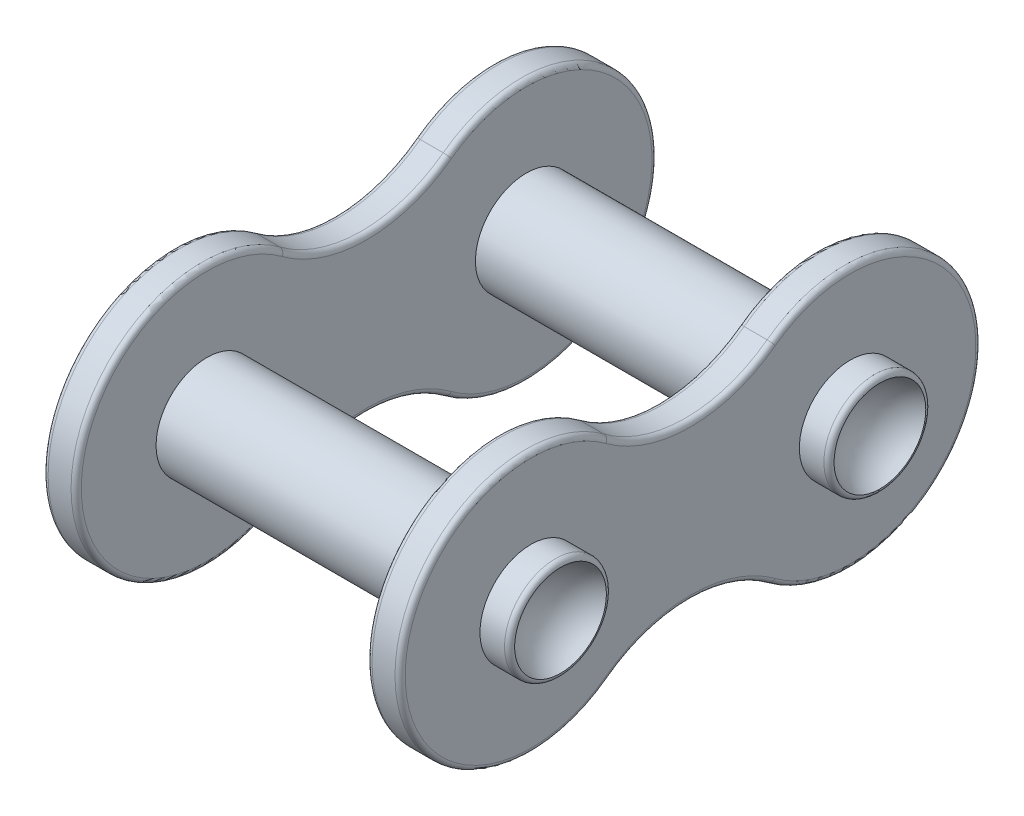
ISO-10303-21;
HEADER;
FILE_DESCRIPTION(('STEP AP214'),'2;1');
FILE_NAME('part.step','',(''),(''),'','','');
FILE_SCHEMA(('AUTOMOTIVE_DESIGN { 1 0 10303 214 1 1 1 1 }'));
ENDSEC;
DATA;
#1=APPLICATION_CONTEXT('core data for automotive mechanical design processes');
#2=APPLICATION_PROTOCOL_DEFINITION('international standard','automotive_design',2000,#1);
#3=PRODUCT_CONTEXT('',#1,'mechanical');
#4=PRODUCT('Part','Part','',(#3));
#5=PRODUCT_RELATED_PRODUCT_CATEGORY('part','',(#4));
#6=PRODUCT_DEFINITION_FORMATION('','',#4);
#7=PRODUCT_DEFINITION_CONTEXT('part definition',#1,'design');
#8=PRODUCT_DEFINITION('design','',#6,#7);
#9=PRODUCT_DEFINITION_SHAPE('','',#8);
#10=(LENGTH_UNIT() NAMED_UNIT(*) SI_UNIT(.MILLI.,.METRE.));
#11=(NAMED_UNIT(*) PLANE_ANGLE_UNIT() SI_UNIT($,.RADIAN.));
#12=(NAMED_UNIT(*) SI_UNIT($,.STERADIAN.) SOLID_ANGLE_UNIT());
#13=UNCERTAINTY_MEASURE_WITH_UNIT(LENGTH_MEASURE(1.E-05),#10,'distance_accuracy_value','');
#14=(GEOMETRIC_REPRESENTATION_CONTEXT(3) GLOBAL_UNCERTAINTY_ASSIGNED_CONTEXT((#13)) GLOBAL_UNIT_ASSIGNED_CONTEXT((#10,
#11,#12)) REPRESENTATION_CONTEXT('',''));
#15=CARTESIAN_POINT('',(0.,0.,0.));
#16=DIRECTION('',(0.,0.,1.));
#17=DIRECTION('',(1.,0.,0.));
#18=AXIS2_PLACEMENT_3D('',#15,#16,#17);
#19=CARTESIAN_POINT('',(-17.575,0.,-7.9375));
#20=DIRECTION('',(1.,0.,0.));
#21=DIRECTION('',(0.,0.,-1.));
#22=AXIS2_PLACEMENT_3D('',#19,#20,#21);
#23=CYLINDRICAL_SURFACE('',#22,2.53);
#24=CARTESIAN_POINT('',(0.,0.,-7.9375));
#25=DIRECTION('',(1.,0.,0.));
#26=DIRECTION('',(0.,0.,-1.));
#27=AXIS2_PLACEMENT_3D('',#24,#25,#26);
#28=CIRCLE('',#27,2.53);
#29=CARTESIAN_POINT('',(0.,0.,-10.4675));
#30=VERTEX_POINT('',#29);
#31=EDGE_CURVE('E303',#30,#30,#28,.T.);
#32=ORIENTED_EDGE('',*,*,#31,.F.);
#33=EDGE_LOOP('',(#32));
#34=FACE_BOUND('',#33,.T.);
#35=CARTESIAN_POINT('',(-14.45,0.,-7.9375));
#36=DIRECTION('',(1.,0.,0.));
#37=DIRECTION('',(0.,0.,-1.));
#38=AXIS2_PLACEMENT_3D('',#35,#36,#37);
#39=CIRCLE('',#38,2.53);
#40=CARTESIAN_POINT('',(-14.45,0.,-10.4675));
#41=VERTEX_POINT('',#40);
#42=EDGE_CURVE('E297',#41,#41,#39,.T.);
#43=ORIENTED_EDGE('',*,*,#42,.T.);
#44=EDGE_LOOP('',(#43));
#45=FACE_BOUND('',#44,.T.);
#46=ADVANCED_FACE('F38',(#34,#45),#23,.T.);
#47=CARTESIAN_POINT('',(1.65,5.33631865351914,-3.96875));
#48=DIRECTION('',(1.,0.,0.));
#49=DIRECTION('',(0.,0.,-1.));
#50=AXIS2_PLACEMENT_3D('',#47,#48,#49);
#51=PLANE('',#50);
#52=CARTESIAN_POINT('',(1.65,0.,-7.9375));
#53=DIRECTION('',(1.,0.,0.));
#54=DIRECTION('',(0.,0.,-1.));
#55=AXIS2_PLACEMENT_3D('',#52,#53,#54);
#56=CIRCLE('',#55,6.246);
#57=CARTESIAN_POINT('',(1.65,-5.01185678442604,-4.21006018527427));
#58=VERTEX_POINT('',#57);
#59=CARTESIAN_POINT('',(1.65,5.01185678442604,-4.21006018527427));
#60=VERTEX_POINT('',#59);
#61=EDGE_CURVE('E178',#58,#60,#56,.T.);
#62=ORIENTED_EDGE('',*,*,#61,.T.);
#63=CARTESIAN_POINT('',(1.65,10.6726373070383,0.));
#64=DIRECTION('',(1.,0.,0.));
#65=DIRECTION('',(0.,0.,-1.));
#66=AXIS2_PLACEMENT_3D('',#63,#64,#65);
#67=CIRCLE('',#66,7.0547177752776);
#68=CARTESIAN_POINT('',(1.65,5.01185678442604,4.21006018527427));
#69=VERTEX_POINT('',#68);
#70=EDGE_CURVE('E157',#60,#69,#67,.F.);
#71=ORIENTED_EDGE('',*,*,#70,.T.);
#72=CARTESIAN_POINT('',(1.65,0.,7.9375));
#73=DIRECTION('',(1.,0.,0.));
#74=DIRECTION('',(0.,0.,-1.));
#75=AXIS2_PLACEMENT_3D('',#72,#73,#74);
#76=CIRCLE('',#75,6.246);
#77=CARTESIAN_POINT('',(1.65,-5.01185678442604,4.21006018527427));
#78=VERTEX_POINT('',#77);
#79=EDGE_CURVE('E166',#69,#78,#76,.T.);
#80=ORIENTED_EDGE('',*,*,#79,.T.);
#81=CARTESIAN_POINT('',(1.65,-10.6726373070383,0.));
#82=DIRECTION('',(1.,0.,0.));
#83=DIRECTION('',(0.,0.,-1.));
#84=AXIS2_PLACEMENT_3D('',#81,#82,#83);
#85=CIRCLE('',#84,7.0547177752776);
#86=EDGE_CURVE('E172',#78,#58,#85,.F.);
#87=ORIENTED_EDGE('',*,*,#86,.T.);
#88=EDGE_LOOP('',(#62,#71,#80,#87));
#89=FACE_BOUND('',#88,.T.);
#90=CARTESIAN_POINT('',(1.65,0.,-7.9375));
#91=DIRECTION('',(1.,0.,0.));
#92=DIRECTION('',(0.,0.,-1.));
#93=AXIS2_PLACEMENT_3D('',#90,#91,#92);
#94=CIRCLE('',#93,2.53);
#95=CARTESIAN_POINT('',(1.65,0.,-10.4675));
#96=VERTEX_POINT('',#95);
#97=EDGE_CURVE('E309',#96,#96,#94,.T.);
#98=ORIENTED_EDGE('',*,*,#97,.F.);
#99=EDGE_LOOP('',(#98));
#100=FACE_BOUND('',#99,.T.);
#101=CARTESIAN_POINT('',(1.65,0.,7.9375));
#102=DIRECTION('',(1.,0.,0.));
#103=DIRECTION('',(0.,0.,1.));
#104=AXIS2_PLACEMENT_3D('',#101,#102,#103);
#105=CIRCLE('',#104,2.53);
#106=CARTESIAN_POINT('',(1.65,0.,10.4675));
#107=VERTEX_POINT('',#106);
#108=EDGE_CURVE('E306',#107,#107,#105,.T.);
#109=ORIENTED_EDGE('',*,*,#108,.F.);
#110=EDGE_LOOP('',(#109));
#111=FACE_BOUND('',#110,.T.);
#112=ADVANCED_FACE('F175',(#89,#100,#111),#51,.T.);
#113=CARTESIAN_POINT('',(0.,5.33631865351914,-3.96875));
#114=DIRECTION('',(1.,0.,0.));
#115=DIRECTION('',(0.,0.,-1.));
#116=AXIS2_PLACEMENT_3D('',#113,#114,#115);
#117=PLANE('',#116);
#118=CARTESIAN_POINT('',(0.,0.,7.9375));
#119=DIRECTION('',(1.,0.,0.));
#120=DIRECTION('',(0.,0.,-1.));
#121=AXIS2_PLACEMENT_3D('',#118,#119,#120);
#122=CIRCLE('',#121,6.246);
#123=CARTESIAN_POINT('',(0.,-5.01185678442604,4.21006018527427));
#124=VERTEX_POINT('',#123);
#125=CARTESIAN_POINT('',(0.,5.01185678442604,4.21006018527427));
#126=VERTEX_POINT('',#125);
#127=EDGE_CURVE('E196',#124,#126,#122,.F.);
#128=ORIENTED_EDGE('',*,*,#127,.T.);
#129=CARTESIAN_POINT('',(0.,10.6726373070383,0.));
#130=DIRECTION('',(1.,0.,0.));
#131=DIRECTION('',(0.,0.,-1.));
#132=AXIS2_PLACEMENT_3D('',#129,#130,#131);
#133=CIRCLE('',#132,7.0547177752776);
#134=CARTESIAN_POINT('',(0.,5.01185678442604,-4.21006018527427));
#135=VERTEX_POINT('',#134);
#136=EDGE_CURVE('E202',#126,#135,#133,.T.);
#137=ORIENTED_EDGE('',*,*,#136,.T.);
#138=CARTESIAN_POINT('',(0.,0.,-7.9375));
#139=DIRECTION('',(1.,0.,0.));
#140=DIRECTION('',(0.,0.,-1.));
#141=AXIS2_PLACEMENT_3D('',#138,#139,#140);
#142=CIRCLE('',#141,6.246);
#143=CARTESIAN_POINT('',(0.,-5.01185678442604,-4.21006018527427));
#144=VERTEX_POINT('',#143);
#145=EDGE_CURVE('E200',#135,#144,#142,.F.);
#146=ORIENTED_EDGE('',*,*,#145,.T.);
#147=CARTESIAN_POINT('',(0.,-10.6726373070383,0.));
#148=DIRECTION('',(1.,0.,0.));
#149=DIRECTION('',(0.,0.,-1.));
#150=AXIS2_PLACEMENT_3D('',#147,#148,#149);
#151=CIRCLE('',#150,7.0547177752776);
#152=EDGE_CURVE('E198',#144,#124,#151,.T.);
#153=ORIENTED_EDGE('',*,*,#152,.T.);
#154=EDGE_LOOP('',(#128,#137,#146,#153));
#155=FACE_BOUND('',#154,.T.);
#156=ORIENTED_EDGE('',*,*,#31,.T.);
#157=EDGE_LOOP('',(#156));
#158=FACE_BOUND('',#157,.T.);
#159=CARTESIAN_POINT('',(0.,0.,7.9375));
#160=DIRECTION('',(1.,0.,0.));
#161=DIRECTION('',(0.,0.,-1.));
#162=AXIS2_PLACEMENT_3D('',#159,#160,#161);
#163=CIRCLE('',#162,2.53);
#164=CARTESIAN_POINT('',(0.,0.,5.4075));
#165=VERTEX_POINT('',#164);
#166=EDGE_CURVE('E332',#165,#165,#163,.F.);
#167=ORIENTED_EDGE('',*,*,#166,.F.);
#168=EDGE_LOOP('',(#167));
#169=FACE_BOUND('',#168,.T.);
#170=ADVANCED_FACE('F391',(#155,#158,#169),#117,.F.);
#171=CARTESIAN_POINT('',(1.65,10.6726373070383,0.));
#172=DIRECTION('',(-1.,0.,0.));
#173=DIRECTION('',(0.,0.,1.));
#174=AXIS2_PLACEMENT_3D('',#171,#172,#173);
#175=CYLINDRICAL_SURFACE('',#174,6.8007177752776);
#176=DIRECTION('',(-1.,0.,0.));
#177=VECTOR('',#176,1.);
#178=CARTESIAN_POINT('',(1.65,5.21566908401686,4.05848001989797));
#179=LINE('',#178,#177);
#180=CARTESIAN_POINT('',(1.396,5.21566908401686,4.05848001989797));
#181=VERTEX_POINT('',#180);
#182=CARTESIAN_POINT('',(0.254000000000001,5.21566908401686,4.05848001989797));
#183=VERTEX_POINT('',#182);
#184=EDGE_CURVE('E321',#181,#183,#179,.T.);
#185=ORIENTED_EDGE('',*,*,#184,.F.);
#186=CARTESIAN_POINT('',(1.396,10.6726373070383,0.));
#187=DIRECTION('',(1.,0.,0.));
#188=DIRECTION('',(0.,0.,-1.));
#189=AXIS2_PLACEMENT_3D('',#186,#187,#188);
#190=CIRCLE('',#189,6.8007177752776);
#191=CARTESIAN_POINT('',(1.396,5.21566908401686,-4.05848001989797));
#192=VERTEX_POINT('',#191);
#193=EDGE_CURVE('E159',#181,#192,#190,.T.);
#194=ORIENTED_EDGE('',*,*,#193,.T.);
#195=DIRECTION('',(-1.,0.,0.));
#196=VECTOR('',#195,1.);
#197=CARTESIAN_POINT('',(1.65,5.21566908401686,-4.05848001989797));
#198=LINE('',#197,#196);
#199=CARTESIAN_POINT('',(0.254000000000001,5.21566908401686,-4.05848001989797));
#200=VERTEX_POINT('',#199);
#201=EDGE_CURVE('E312',#192,#200,#198,.T.);
#202=ORIENTED_EDGE('',*,*,#201,.T.);
#203=CARTESIAN_POINT('',(0.254000000000001,10.6726373070383,0.));
#204=DIRECTION('',(1.,0.,0.));
#205=DIRECTION('',(0.,0.,-1.));
#206=AXIS2_PLACEMENT_3D('',#203,#204,#205);
#207=CIRCLE('',#206,6.8007177752776);
#208=EDGE_CURVE('E180',#200,#183,#207,.F.);
#209=ORIENTED_EDGE('',*,*,#208,.T.);
#210=EDGE_LOOP('',(#185,#194,#202,#209));
#211=FACE_BOUND('',#210,.T.);
#212=ADVANCED_FACE('F363',(#211),#175,.F.);
#213=CARTESIAN_POINT('',(1.65,0.,7.9375));
#214=DIRECTION('',(-1.,0.,0.));
#215=DIRECTION('',(0.,0.,1.));
#216=AXIS2_PLACEMENT_3D('',#213,#214,#215);
#217=CYLINDRICAL_SURFACE('',#216,6.5);
#218=DIRECTION('',(-1.,0.,0.));
#219=VECTOR('',#218,1.);
#220=CARTESIAN_POINT('',(1.65,-5.21566908401686,4.05848001989797));
#221=LINE('',#220,#219);
#222=CARTESIAN_POINT('',(1.396,-5.21566908401686,4.05848001989797));
#223=VERTEX_POINT('',#222);
#224=CARTESIAN_POINT('',(0.254000000000001,-5.21566908401686,4.05848001989797));
#225=VERTEX_POINT('',#224);
#226=EDGE_CURVE('E318',#223,#225,#221,.T.);
#227=ORIENTED_EDGE('',*,*,#226,.F.);
#228=CARTESIAN_POINT('',(1.396,0.,7.9375));
#229=DIRECTION('',(1.,0.,0.));
#230=DIRECTION('',(0.,0.,-1.));
#231=AXIS2_PLACEMENT_3D('',#228,#229,#230);
#232=CIRCLE('',#231,6.5);
#233=EDGE_CURVE('E236',#223,#181,#232,.F.);
#234=ORIENTED_EDGE('',*,*,#233,.T.);
#235=ORIENTED_EDGE('',*,*,#184,.T.);
#236=CARTESIAN_POINT('',(0.254000000000001,0.,7.9375));
#237=DIRECTION('',(1.,0.,0.));
#238=DIRECTION('',(0.,0.,-1.));
#239=AXIS2_PLACEMENT_3D('',#236,#237,#238);
#240=CIRCLE('',#239,6.5);
#241=EDGE_CURVE('E234',#183,#225,#240,.T.);
#242=ORIENTED_EDGE('',*,*,#241,.T.);
#243=EDGE_LOOP('',(#227,#234,#235,#242));
#244=FACE_BOUND('',#243,.T.);
#245=ADVANCED_FACE('F379',(#244),#217,.T.);
#246=CARTESIAN_POINT('',(1.65,-10.6726373070383,0.));
#247=DIRECTION('',(-1.,0.,0.));
#248=DIRECTION('',(0.,0.,1.));
#249=AXIS2_PLACEMENT_3D('',#246,#247,#248);
#250=CYLINDRICAL_SURFACE('',#249,6.8007177752776);
#251=DIRECTION('',(-1.,0.,0.));
#252=VECTOR('',#251,1.);
#253=CARTESIAN_POINT('',(1.65,-5.21566908401686,-4.05848001989798));
#254=LINE('',#253,#252);
#255=CARTESIAN_POINT('',(1.396,-5.21566908401686,-4.05848001989798));
#256=VERTEX_POINT('',#255);
#257=CARTESIAN_POINT('',(0.254000000000001,-5.21566908401686,-4.05848001989798));
#258=VERTEX_POINT('',#257);
#259=EDGE_CURVE('E315',#256,#258,#254,.T.);
#260=ORIENTED_EDGE('',*,*,#259,.F.);
#261=CARTESIAN_POINT('',(1.396,-10.6726373070383,0.));
#262=DIRECTION('',(1.,0.,0.));
#263=DIRECTION('',(0.,0.,-1.));
#264=AXIS2_PLACEMENT_3D('',#261,#262,#263);
#265=CIRCLE('',#264,6.8007177752776);
#266=EDGE_CURVE('E194',#256,#223,#265,.T.);
#267=ORIENTED_EDGE('',*,*,#266,.T.);
#268=ORIENTED_EDGE('',*,*,#226,.T.);
#269=CARTESIAN_POINT('',(0.254000000000001,-10.6726373070383,0.));
#270=DIRECTION('',(1.,0.,0.));
#271=DIRECTION('',(0.,0.,-1.));
#272=AXIS2_PLACEMENT_3D('',#269,#270,#271);
#273=CIRCLE('',#272,6.8007177752776);
#274=EDGE_CURVE('E192',#225,#258,#273,.F.);
#275=ORIENTED_EDGE('',*,*,#274,.T.);
#276=EDGE_LOOP('',(#260,#267,#268,#275));
#277=FACE_BOUND('',#276,.T.);
#278=ADVANCED_FACE('F382',(#277),#250,.F.);
#279=CARTESIAN_POINT('',(1.65,0.,-7.9375));
#280=DIRECTION('',(-1.,0.,0.));
#281=DIRECTION('',(0.,0.,1.));
#282=AXIS2_PLACEMENT_3D('',#279,#280,#281);
#283=CYLINDRICAL_SURFACE('',#282,6.5);
#284=ORIENTED_EDGE('',*,*,#201,.F.);
#285=CARTESIAN_POINT('',(1.396,0.,-7.9375));
#286=DIRECTION('',(1.,0.,0.));
#287=DIRECTION('',(0.,0.,-1.));
#288=AXIS2_PLACEMENT_3D('',#285,#286,#287);
#289=CIRCLE('',#288,6.5);
#290=EDGE_CURVE('E190',#192,#256,#289,.F.);
#291=ORIENTED_EDGE('',*,*,#290,.T.);
#292=ORIENTED_EDGE('',*,*,#259,.T.);
#293=CARTESIAN_POINT('',(0.254000000000001,0.,-7.9375));
#294=DIRECTION('',(1.,0.,0.));
#295=DIRECTION('',(0.,0.,-1.));
#296=AXIS2_PLACEMENT_3D('',#293,#294,#295);
#297=CIRCLE('',#296,6.5);
#298=EDGE_CURVE('E188',#258,#200,#297,.T.);
#299=ORIENTED_EDGE('',*,*,#298,.T.);
#300=EDGE_LOOP('',(#284,#291,#292,#299));
#301=FACE_BOUND('',#300,.T.);
#302=ADVANCED_FACE('F365',(#301),#283,.T.);
#303=CARTESIAN_POINT('',(2.87103495547423,0.,-7.9375));
#304=DIRECTION('',(1.,0.,0.));
#305=DIRECTION('',(0.,0.,-1.));
#306=AXIS2_PLACEMENT_3D('',#303,#304,#305);
#307=CIRCLE('',#306,2.53);
#308=CARTESIAN_POINT('',(2.87103495547423,0.,-10.4675));
#309=VERTEX_POINT('',#308);
#310=EDGE_CURVE('E344',#309,#309,#307,.F.);
#311=ORIENTED_EDGE('',*,*,#310,.T.);
#312=EDGE_LOOP('',(#311));
#313=FACE_BOUND('',#312,.T.);
#314=ORIENTED_EDGE('',*,*,#97,.T.);
#315=EDGE_LOOP('',(#314));
#316=FACE_BOUND('',#315,.T.);
#317=ADVANCED_FACE('F421',(#313,#316),#23,.T.);
#318=CARTESIAN_POINT('',(-16.1,10.6726373070383,0.));
#319=DIRECTION('',(1.,0.,0.));
#320=DIRECTION('',(0.,0.,-1.));
#321=AXIS2_PLACEMENT_3D('',#318,#319,#320);
#322=CYLINDRICAL_SURFACE('',#321,6.8007177752776);
#323=DIRECTION('',(1.,0.,0.));
#324=VECTOR('',#323,1.);
#325=CARTESIAN_POINT('',(-16.1,5.21566908401686,-4.05848001989797));
#326=LINE('',#325,#324);
#327=CARTESIAN_POINT('',(-15.846,5.21566908401686,-4.05848001989797));
#328=VERTEX_POINT('',#327);
#329=CARTESIAN_POINT('',(-14.704,5.21566908401686,-4.05848001989797));
#330=VERTEX_POINT('',#329);
#331=EDGE_CURVE('E295',#328,#330,#326,.T.);
#332=ORIENTED_EDGE('',*,*,#331,.F.);
#333=CARTESIAN_POINT('',(-15.846,10.6726373070383,0.));
#334=DIRECTION('',(-1.,0.,0.));
#335=DIRECTION('',(0.,0.,1.));
#336=AXIS2_PLACEMENT_3D('',#333,#334,#335);
#337=CIRCLE('',#336,6.8007177752776);
#338=CARTESIAN_POINT('',(-15.846,5.21566908401686,4.05848001989797));
#339=VERTEX_POINT('',#338);
#340=EDGE_CURVE('E208',#328,#339,#337,.T.);
#341=ORIENTED_EDGE('',*,*,#340,.T.);
#342=DIRECTION('',(1.,0.,0.));
#343=VECTOR('',#342,1.);
#344=CARTESIAN_POINT('',(-16.1,5.21566908401686,4.05848001989797));
#345=LINE('',#344,#343);
#346=CARTESIAN_POINT('',(-14.704,5.21566908401686,4.05848001989797));
#347=VERTEX_POINT('',#346);
#348=EDGE_CURVE('E293',#339,#347,#345,.T.);
#349=ORIENTED_EDGE('',*,*,#348,.T.);
#350=CARTESIAN_POINT('',(-14.704,10.6726373070383,0.));
#351=DIRECTION('',(-1.,0.,0.));
#352=DIRECTION('',(0.,0.,1.));
#353=AXIS2_PLACEMENT_3D('',#350,#351,#352);
#354=CIRCLE('',#353,6.8007177752776);
#355=EDGE_CURVE('E205',#347,#330,#354,.F.);
#356=ORIENTED_EDGE('',*,*,#355,.T.);
#357=EDGE_LOOP('',(#332,#341,#349,#356));
#358=FACE_BOUND('',#357,.T.);
#359=ADVANCED_FACE('F434',(#358),#322,.F.);
#360=CARTESIAN_POINT('',(-16.1,0.,-7.9375));
#361=DIRECTION('',(1.,0.,0.));
#362=DIRECTION('',(0.,0.,-1.));
#363=AXIS2_PLACEMENT_3D('',#360,#361,#362);
#364=CYLINDRICAL_SURFACE('',#363,6.5);
#365=DIRECTION('',(1.,0.,0.));
#366=VECTOR('',#365,1.);
#367=CARTESIAN_POINT('',(-16.1,-5.21566908401686,-4.05848001989798));
#368=LINE('',#367,#366);
#369=CARTESIAN_POINT('',(-15.846,-5.21566908401686,-4.05848001989798));
#370=VERTEX_POINT('',#369);
#371=CARTESIAN_POINT('',(-14.704,-5.21566908401686,-4.05848001989798));
#372=VERTEX_POINT('',#371);
#373=EDGE_CURVE('E287',#370,#372,#368,.T.);
#374=ORIENTED_EDGE('',*,*,#373,.F.);
#375=CARTESIAN_POINT('',(-15.846,0.,-7.9375));
#376=DIRECTION('',(-1.,0.,0.));
#377=DIRECTION('',(0.,0.,1.));
#378=AXIS2_PLACEMENT_3D('',#375,#376,#377);
#379=CIRCLE('',#378,6.5);
#380=EDGE_CURVE('E222',#370,#328,#379,.F.);
#381=ORIENTED_EDGE('',*,*,#380,.T.);
#382=ORIENTED_EDGE('',*,*,#331,.T.);
#383=CARTESIAN_POINT('',(-14.704,0.,-7.9375));
#384=DIRECTION('',(-1.,0.,0.));
#385=DIRECTION('',(0.,0.,1.));
#386=AXIS2_PLACEMENT_3D('',#383,#384,#385);
#387=CIRCLE('',#386,6.5);
#388=EDGE_CURVE('E220',#330,#372,#387,.T.);
#389=ORIENTED_EDGE('',*,*,#388,.T.);
#390=EDGE_LOOP('',(#374,#381,#382,#389));
#391=FACE_BOUND('',#390,.T.);
#392=ADVANCED_FACE('F440',(#391),#364,.T.);
#393=CARTESIAN_POINT('',(-16.1,-10.6726373070383,0.));
#394=DIRECTION('',(1.,0.,0.));
#395=DIRECTION('',(0.,0.,-1.));
#396=AXIS2_PLACEMENT_3D('',#393,#394,#395);
#397=CYLINDRICAL_SURFACE('',#396,6.8007177752776);
#398=DIRECTION('',(1.,0.,0.));
#399=VECTOR('',#398,1.);
#400=CARTESIAN_POINT('',(-16.1,-5.21566908401686,4.05848001989797));
#401=LINE('',#400,#399);
#402=CARTESIAN_POINT('',(-15.846,-5.21566908401686,4.05848001989797));
#403=VERTEX_POINT('',#402);
#404=CARTESIAN_POINT('',(-14.704,-5.21566908401686,4.05848001989797));
#405=VERTEX_POINT('',#404);
#406=EDGE_CURVE('E284',#403,#405,#401,.T.);
#407=ORIENTED_EDGE('',*,*,#406,.F.);
#408=CARTESIAN_POINT('',(-15.846,-10.6726373070383,0.));
#409=DIRECTION('',(-1.,0.,0.));
#410=DIRECTION('',(0.,0.,1.));
#411=AXIS2_PLACEMENT_3D('',#408,#409,#410);
#412=CIRCLE('',#411,6.8007177752776);
#413=EDGE_CURVE('E226',#403,#370,#412,.T.);
#414=ORIENTED_EDGE('',*,*,#413,.T.);
#415=ORIENTED_EDGE('',*,*,#373,.T.);
#416=CARTESIAN_POINT('',(-14.704,-10.6726373070383,0.));
#417=DIRECTION('',(-1.,0.,0.));
#418=DIRECTION('',(0.,0.,1.));
#419=AXIS2_PLACEMENT_3D('',#416,#417,#418);
#420=CIRCLE('',#419,6.8007177752776);
#421=EDGE_CURVE('E224',#372,#405,#420,.F.);
#422=ORIENTED_EDGE('',*,*,#421,.T.);
#423=EDGE_LOOP('',(#407,#414,#415,#422));
#424=FACE_BOUND('',#423,.T.);
#425=ADVANCED_FACE('F283',(#424),#397,.F.);
#426=CARTESIAN_POINT('',(-16.1,0.,7.9375));
#427=DIRECTION('',(1.,0.,0.));
#428=DIRECTION('',(0.,0.,-1.));
#429=AXIS2_PLACEMENT_3D('',#426,#427,#428);
#430=CYLINDRICAL_SURFACE('',#429,6.5);
#431=ORIENTED_EDGE('',*,*,#348,.F.);
#432=CARTESIAN_POINT('',(-15.846,0.,7.9375));
#433=DIRECTION('',(-1.,0.,0.));
#434=DIRECTION('',(0.,0.,1.));
#435=AXIS2_PLACEMENT_3D('',#432,#433,#434);
#436=CIRCLE('',#435,6.5);
#437=EDGE_CURVE('E11',#339,#403,#436,.F.);
#438=ORIENTED_EDGE('',*,*,#437,.T.);
#439=ORIENTED_EDGE('',*,*,#406,.T.);
#440=CARTESIAN_POINT('',(-14.704,0.,7.9375));
#441=DIRECTION('',(-1.,0.,0.));
#442=DIRECTION('',(0.,0.,1.));
#443=AXIS2_PLACEMENT_3D('',#440,#441,#442);
#444=CIRCLE('',#443,6.5);
#445=EDGE_CURVE('E47',#405,#347,#444,.T.);
#446=ORIENTED_EDGE('',*,*,#445,.T.);
#447=EDGE_LOOP('',(#431,#438,#439,#446));
#448=FACE_BOUND('',#447,.T.);
#449=ADVANCED_FACE('F290',(#448),#430,.T.);
#450=CARTESIAN_POINT('',(-16.1,5.33631865351914,-3.96875));
#451=DIRECTION('',(-1.,0.,0.));
#452=DIRECTION('',(0.,0.,-1.));
#453=AXIS2_PLACEMENT_3D('',#450,#451,#452);
#454=PLANE('',#453);
#455=CARTESIAN_POINT('',(-16.1,0.,7.9375));
#456=DIRECTION('',(-1.,0.,0.));
#457=DIRECTION('',(0.,0.,1.));
#458=AXIS2_PLACEMENT_3D('',#455,#456,#457);
#459=CIRCLE('',#458,6.246);
#460=CARTESIAN_POINT('',(-16.1,-5.01185678442604,4.21006018527427));
#461=VERTEX_POINT('',#460);
#462=CARTESIAN_POINT('',(-16.1,5.01185678442604,4.21006018527427));
#463=VERTEX_POINT('',#462);
#464=EDGE_CURVE('E211',#461,#463,#459,.T.);
#465=ORIENTED_EDGE('',*,*,#464,.T.);
#466=CARTESIAN_POINT('',(-16.1,10.6726373070383,0.));
#467=DIRECTION('',(-1.,0.,0.));
#468=DIRECTION('',(0.,0.,1.));
#469=AXIS2_PLACEMENT_3D('',#466,#467,#468);
#470=CIRCLE('',#469,7.0547177752776);
#471=CARTESIAN_POINT('',(-16.1,5.01185678442604,-4.21006018527427));
#472=VERTEX_POINT('',#471);
#473=EDGE_CURVE('E217',#463,#472,#470,.F.);
#474=ORIENTED_EDGE('',*,*,#473,.T.);
#475=CARTESIAN_POINT('',(-16.1,0.,-7.9375));
#476=DIRECTION('',(-1.,0.,0.));
#477=DIRECTION('',(0.,0.,1.));
#478=AXIS2_PLACEMENT_3D('',#475,#476,#477);
#479=CIRCLE('',#478,6.246);
#480=CARTESIAN_POINT('',(-16.1,-5.01185678442604,-4.21006018527427));
#481=VERTEX_POINT('',#480);
#482=EDGE_CURVE('E215',#472,#481,#479,.T.);
#483=ORIENTED_EDGE('',*,*,#482,.T.);
#484=CARTESIAN_POINT('',(-16.1,-10.6726373070383,0.));
#485=DIRECTION('',(-1.,0.,0.));
#486=DIRECTION('',(0.,0.,1.));
#487=AXIS2_PLACEMENT_3D('',#484,#485,#486);
#488=CIRCLE('',#487,7.0547177752776);
#489=EDGE_CURVE('E213',#481,#461,#488,.F.);
#490=ORIENTED_EDGE('',*,*,#489,.T.);
#491=EDGE_LOOP('',(#465,#474,#483,#490));
#492=FACE_BOUND('',#491,.T.);
#493=CARTESIAN_POINT('',(-16.1,0.,7.9375));
#494=DIRECTION('',(-1.,0.,0.));
#495=DIRECTION('',(0.,0.,1.));
#496=AXIS2_PLACEMENT_3D('',#493,#494,#495);
#497=CIRCLE('',#496,2.53);
#498=CARTESIAN_POINT('',(-16.1,0.,10.4675));
#499=VERTEX_POINT('',#498);
#500=EDGE_CURVE('E336',#499,#499,#497,.F.);
#501=ORIENTED_EDGE('',*,*,#500,.T.);
#502=EDGE_LOOP('',(#501));
#503=FACE_BOUND('',#502,.T.);
#504=CARTESIAN_POINT('',(-16.1,0.,-7.9375));
#505=DIRECTION('',(-1.,0.,0.));
#506=DIRECTION('',(0.,0.,1.));
#507=AXIS2_PLACEMENT_3D('',#504,#505,#506);
#508=CIRCLE('',#507,2.53);
#509=CARTESIAN_POINT('',(-16.1,0.,-5.4075));
#510=VERTEX_POINT('',#509);
#511=EDGE_CURVE('E324',#510,#510,#508,.F.);
#512=ORIENTED_EDGE('',*,*,#511,.T.);
#513=EDGE_LOOP('',(#512));
#514=FACE_BOUND('',#513,.T.);
#515=ADVANCED_FACE('F412',(#492,#503,#514),#454,.T.);
#516=CARTESIAN_POINT('',(-14.45,5.33631865351914,-3.96875));
#517=DIRECTION('',(-1.,0.,0.));
#518=DIRECTION('',(0.,0.,-1.));
#519=AXIS2_PLACEMENT_3D('',#516,#517,#518);
#520=PLANE('',#519);
#521=CARTESIAN_POINT('',(-14.45,0.,-7.9375));
#522=DIRECTION('',(-1.,0.,0.));
#523=DIRECTION('',(0.,0.,1.));
#524=AXIS2_PLACEMENT_3D('',#521,#522,#523);
#525=CIRCLE('',#524,6.246);
#526=CARTESIAN_POINT('',(-14.45,-5.01185678442604,-4.21006018527427));
#527=VERTEX_POINT('',#526);
#528=CARTESIAN_POINT('',(-14.45,5.01185678442604,-4.21006018527427));
#529=VERTEX_POINT('',#528);
#530=EDGE_CURVE('E55',#527,#529,#525,.F.);
#531=ORIENTED_EDGE('',*,*,#530,.T.);
#532=CARTESIAN_POINT('',(-14.45,10.6726373070383,0.));
#533=DIRECTION('',(-1.,0.,0.));
#534=DIRECTION('',(0.,0.,1.));
#535=AXIS2_PLACEMENT_3D('',#532,#533,#534);
#536=CIRCLE('',#535,7.0547177752776);
#537=CARTESIAN_POINT('',(-14.45,5.01185678442604,4.21006018527427));
#538=VERTEX_POINT('',#537);
#539=EDGE_CURVE('E232',#529,#538,#536,.T.);
#540=ORIENTED_EDGE('',*,*,#539,.T.);
#541=CARTESIAN_POINT('',(-14.45,0.,7.9375));
#542=DIRECTION('',(-1.,0.,0.));
#543=DIRECTION('',(0.,0.,1.));
#544=AXIS2_PLACEMENT_3D('',#541,#542,#543);
#545=CIRCLE('',#544,6.246);
#546=CARTESIAN_POINT('',(-14.45,-5.01185678442604,4.21006018527427));
#547=VERTEX_POINT('',#546);
#548=EDGE_CURVE('E228',#538,#547,#545,.F.);
#549=ORIENTED_EDGE('',*,*,#548,.T.);
#550=CARTESIAN_POINT('',(-14.45,-10.6726373070383,0.));
#551=DIRECTION('',(-1.,0.,0.));
#552=DIRECTION('',(0.,0.,1.));
#553=AXIS2_PLACEMENT_3D('',#550,#551,#552);
#554=CIRCLE('',#553,7.0547177752776);
#555=EDGE_CURVE('E60',#547,#527,#554,.T.);
#556=ORIENTED_EDGE('',*,*,#555,.T.);
#557=EDGE_LOOP('',(#531,#540,#549,#556));
#558=FACE_BOUND('',#557,.T.);
#559=CARTESIAN_POINT('',(-14.45,0.,7.9375));
#560=DIRECTION('',(1.,0.,0.));
#561=DIRECTION('',(0.,0.,1.));
#562=AXIS2_PLACEMENT_3D('',#559,#560,#561);
#563=CIRCLE('',#562,2.53);
#564=CARTESIAN_POINT('',(-14.45,0.,10.4675));
#565=VERTEX_POINT('',#564);
#566=EDGE_CURVE('E331',#565,#565,#563,.T.);
#567=ORIENTED_EDGE('',*,*,#566,.F.);
#568=EDGE_LOOP('',(#567));
#569=FACE_BOUND('',#568,.T.);
#570=ORIENTED_EDGE('',*,*,#42,.F.);
#571=EDGE_LOOP('',(#570));
#572=FACE_BOUND('',#571,.T.);
#573=ADVANCED_FACE('F409',(#558,#569,#572),#520,.F.);
#574=CARTESIAN_POINT('',(-17.3210349554742,0.,-7.9375));
#575=DIRECTION('',(-1.,0.,0.));
#576=DIRECTION('',(0.,0.,1.));
#577=AXIS2_PLACEMENT_3D('',#574,#575,#576);
#578=CIRCLE('',#577,2.53);
#579=CARTESIAN_POINT('',(-17.3210349554742,0.,-5.4075));
#580=VERTEX_POINT('',#579);
#581=EDGE_CURVE('E173',#580,#580,#578,.F.);
#582=ORIENTED_EDGE('',*,*,#581,.T.);
#583=EDGE_LOOP('',(#582));
#584=FACE_BOUND('',#583,.T.);
#585=ORIENTED_EDGE('',*,*,#511,.F.);
#586=EDGE_LOOP('',(#585));
#587=FACE_BOUND('',#586,.T.);
#588=ADVANCED_FACE('F411',(#584,#587),#23,.T.);
#589=CARTESIAN_POINT('',(-18.6,0.,-7.9375));
#590=DIRECTION('',(1.,0.,0.));
#591=DIRECTION('',(0.,0.,1.));
#592=AXIS2_PLACEMENT_3D('',#589,#590,#591);
#593=SPHERICAL_SURFACE('',#592,2.5);
#594=CARTESIAN_POINT('',(-17.575,0.,-7.9375));
#595=DIRECTION('',(1.,0.,0.));
#596=DIRECTION('',(0.,0.,-1.));
#597=AXIS2_PLACEMENT_3D('',#594,#595,#596);
#598=CIRCLE('',#597,2.28021380576471);
#599=CARTESIAN_POINT('',(-17.575,0.,-10.2177138057647));
#600=VERTEX_POINT('',#599);
#601=EDGE_CURVE('E328',#600,#600,#598,.T.);
#602=ORIENTED_EDGE('',*,*,#601,.F.);
#603=EDGE_LOOP('',(#602));
#604=FACE_BOUND('',#603,.T.);
#605=ADVANCED_FACE('F418',(#604),#593,.F.);
#606=CARTESIAN_POINT('',(-17.575,0.,7.9375));
#607=DIRECTION('',(1.,0.,0.));
#608=DIRECTION('',(0.,0.,-1.));
#609=AXIS2_PLACEMENT_3D('',#606,#607,#608);
#610=CYLINDRICAL_SURFACE('',#609,2.53);
#611=ORIENTED_EDGE('',*,*,#566,.T.);
#612=EDGE_LOOP('',(#611));
#613=FACE_BOUND('',#612,.T.);
#614=ORIENTED_EDGE('',*,*,#166,.T.);
#615=EDGE_LOOP('',(#614));
#616=FACE_BOUND('',#615,.T.);
#617=ADVANCED_FACE('F455',(#613,#616),#610,.T.);
#618=CARTESIAN_POINT('',(-17.3210349554742,0.,7.9375));
#619=DIRECTION('',(-1.,0.,0.));
#620=DIRECTION('',(0.,0.,1.));
#621=AXIS2_PLACEMENT_3D('',#618,#619,#620);
#622=CIRCLE('',#621,2.53);
#623=CARTESIAN_POINT('',(-17.3210349554742,0.,10.4675));
#624=VERTEX_POINT('',#623);
#625=EDGE_CURVE('E347',#624,#624,#622,.F.);
#626=ORIENTED_EDGE('',*,*,#625,.T.);
#627=EDGE_LOOP('',(#626));
#628=FACE_BOUND('',#627,.T.);
#629=ORIENTED_EDGE('',*,*,#500,.F.);
#630=EDGE_LOOP('',(#629));
#631=FACE_BOUND('',#630,.T.);
#632=ADVANCED_FACE('F452',(#628,#631),#610,.T.);
#633=CARTESIAN_POINT('',(2.87103495547423,0.,7.9375));
#634=DIRECTION('',(1.,0.,0.));
#635=DIRECTION('',(0.,0.,-1.));
#636=AXIS2_PLACEMENT_3D('',#633,#634,#635);
#637=CIRCLE('',#636,2.53);
#638=CARTESIAN_POINT('',(2.87103495547423,0.,5.4075));
#639=VERTEX_POINT('',#638);
#640=EDGE_CURVE('E327',#639,#639,#637,.F.);
#641=ORIENTED_EDGE('',*,*,#640,.T.);
#642=EDGE_LOOP('',(#641));
#643=FACE_BOUND('',#642,.T.);
#644=ORIENTED_EDGE('',*,*,#108,.T.);
#645=EDGE_LOOP('',(#644));
#646=FACE_BOUND('',#645,.T.);
#647=ADVANCED_FACE('F449',(#643,#646),#610,.T.);
#648=CARTESIAN_POINT('',(-18.6,0.,7.9375));
#649=DIRECTION('',(1.,0.,0.));
#650=DIRECTION('',(0.,0.,-1.));
#651=AXIS2_PLACEMENT_3D('',#648,#649,#650);
#652=SPHERICAL_SURFACE('',#651,2.5);
#653=CARTESIAN_POINT('',(-17.575,0.,7.9375));
#654=DIRECTION('',(1.,0.,0.));
#655=DIRECTION('',(0.,0.,-1.));
#656=AXIS2_PLACEMENT_3D('',#653,#654,#655);
#657=CIRCLE('',#656,2.28021380576471);
#658=CARTESIAN_POINT('',(-17.575,0.,5.65728619423529));
#659=VERTEX_POINT('',#658);
#660=EDGE_CURVE('E333',#659,#659,#657,.T.);
#661=ORIENTED_EDGE('',*,*,#660,.F.);
#662=EDGE_LOOP('',(#661));
#663=FACE_BOUND('',#662,.T.);
#664=ADVANCED_FACE('F451',(#663),#652,.F.);
#665=CARTESIAN_POINT('',(4.15,0.,7.9375));
#666=DIRECTION('',(-1.,0.,0.));
#667=DIRECTION('',(0.,0.,-1.));
#668=AXIS2_PLACEMENT_3D('',#665,#666,#667);
#669=SPHERICAL_SURFACE('',#668,2.5);
#670=CARTESIAN_POINT('',(3.125,0.,7.9375));
#671=DIRECTION('',(1.,0.,0.));
#672=DIRECTION('',(0.,0.,-1.));
#673=AXIS2_PLACEMENT_3D('',#670,#671,#672);
#674=CIRCLE('',#673,2.28021380576471);
#675=CARTESIAN_POINT('',(3.125,0.,5.65728619423529));
#676=VERTEX_POINT('',#675);
#677=EDGE_CURVE('E337',#676,#676,#674,.T.);
#678=ORIENTED_EDGE('',*,*,#677,.T.);
#679=EDGE_LOOP('',(#678));
#680=FACE_BOUND('',#679,.T.);
#681=ADVANCED_FACE('F460',(#680),#669,.F.);
#682=CARTESIAN_POINT('',(4.15,0.,-7.9375));
#683=DIRECTION('',(-1.,0.,0.));
#684=DIRECTION('',(0.,0.,1.));
#685=AXIS2_PLACEMENT_3D('',#682,#683,#684);
#686=SPHERICAL_SURFACE('',#685,2.5);
#687=CARTESIAN_POINT('',(3.125,0.,-7.9375));
#688=DIRECTION('',(1.,0.,0.));
#689=DIRECTION('',(0.,0.,-1.));
#690=AXIS2_PLACEMENT_3D('',#687,#688,#689);
#691=CIRCLE('',#690,2.28021380576471);
#692=CARTESIAN_POINT('',(3.125,0.,-10.2177138057647));
#693=VERTEX_POINT('',#692);
#694=EDGE_CURVE('E244',#693,#693,#691,.T.);
#695=ORIENTED_EDGE('',*,*,#694,.T.);
#696=EDGE_LOOP('',(#695));
#697=FACE_BOUND('',#696,.T.);
#698=ADVANCED_FACE('F697',(#697),#686,.F.);
#699=CARTESIAN_POINT('',(2.87103495547423,0.,7.9375));
#700=DIRECTION('',(1.,0.,0.));
#701=DIRECTION('',(0.,0.,-1.));
#702=AXIS2_PLACEMENT_3D('',#699,#700,#701);
#703=TOROIDAL_SURFACE('',#702,2.276,0.254000000000001);
#704=ORIENTED_EDGE('',*,*,#677,.F.);
#705=EDGE_LOOP('',(#704));
#706=FACE_BOUND('',#705,.T.);
#707=ORIENTED_EDGE('',*,*,#640,.F.);
#708=EDGE_LOOP('',(#707));
#709=FACE_BOUND('',#708,.T.);
#710=ADVANCED_FACE('F689',(#706,#709),#703,.T.);
#711=CARTESIAN_POINT('',(2.87103495547423,0.,-7.9375));
#712=DIRECTION('',(1.,0.,0.));
#713=DIRECTION('',(0.,0.,-1.));
#714=AXIS2_PLACEMENT_3D('',#711,#712,#713);
#715=TOROIDAL_SURFACE('',#714,2.276,0.254000000000001);
#716=ORIENTED_EDGE('',*,*,#310,.F.);
#717=EDGE_LOOP('',(#716));
#718=FACE_BOUND('',#717,.T.);
#719=ORIENTED_EDGE('',*,*,#694,.F.);
#720=EDGE_LOOP('',(#719));
#721=FACE_BOUND('',#720,.T.);
#722=ADVANCED_FACE('F490',(#718,#721),#715,.T.);
#723=CARTESIAN_POINT('',(-17.3210349554742,0.,7.9375));
#724=DIRECTION('',(-1.,0.,0.));
#725=DIRECTION('',(0.,0.,1.));
#726=AXIS2_PLACEMENT_3D('',#723,#724,#725);
#727=TOROIDAL_SURFACE('',#726,2.276,0.254000000000001);
#728=ORIENTED_EDGE('',*,*,#625,.F.);
#729=EDGE_LOOP('',(#728));
#730=FACE_BOUND('',#729,.T.);
#731=ORIENTED_EDGE('',*,*,#660,.T.);
#732=EDGE_LOOP('',(#731));
#733=FACE_BOUND('',#732,.T.);
#734=ADVANCED_FACE('F479',(#730,#733),#727,.T.);
#735=CARTESIAN_POINT('',(-17.3210349554742,0.,-7.9375));
#736=DIRECTION('',(-1.,0.,0.));
#737=DIRECTION('',(0.,0.,1.));
#738=AXIS2_PLACEMENT_3D('',#735,#736,#737);
#739=TOROIDAL_SURFACE('',#738,2.276,0.254000000000001);
#740=ORIENTED_EDGE('',*,*,#601,.T.);
#741=EDGE_LOOP('',(#740));
#742=FACE_BOUND('',#741,.T.);
#743=ORIENTED_EDGE('',*,*,#581,.F.);
#744=EDGE_LOOP('',(#743));
#745=FACE_BOUND('',#744,.T.);
#746=ADVANCED_FACE('F476',(#742,#745),#739,.T.);
#747=CARTESIAN_POINT('',(1.396,-10.6726373070383,0.));
#748=DIRECTION('',(1.,0.,0.));
#749=DIRECTION('',(0.,0.,-1.));
#750=AXIS2_PLACEMENT_3D('',#747,#748,#749);
#751=TOROIDAL_SURFACE('',#750,7.0547177752776,0.254000000000001);
#752=CARTESIAN_POINT('',(1.396,-5.01185678442604,4.21006018527427));
#753=DIRECTION('',(0.,-0.596772304631081,0.802410628310286));
#754=DIRECTION('',(0.,-0.802410628310286,-0.596772304631081));
#755=AXIS2_PLACEMENT_3D('',#752,#753,#754);
#756=CIRCLE('',#755,0.254000000000001);
#757=EDGE_CURVE('E169',#223,#78,#756,.T.);
#758=ORIENTED_EDGE('',*,*,#757,.F.);
#759=ORIENTED_EDGE('',*,*,#266,.F.);
#760=CARTESIAN_POINT('',(1.396,-5.01185678442604,-4.21006018527427));
#761=DIRECTION('',(0.,-0.596772304631081,-0.802410628310286));
#762=DIRECTION('',(0.,0.802410628310286,-0.596772304631081));
#763=AXIS2_PLACEMENT_3D('',#760,#761,#762);
#764=CIRCLE('',#763,0.254000000000001);
#765=EDGE_CURVE('E241',#58,#256,#764,.T.);
#766=ORIENTED_EDGE('',*,*,#765,.F.);
#767=ORIENTED_EDGE('',*,*,#86,.F.);
#768=EDGE_LOOP('',(#758,#759,#766,#767));
#769=FACE_BOUND('',#768,.T.);
#770=ADVANCED_FACE('F354',(#769),#751,.T.);
#771=CARTESIAN_POINT('',(1.396,0.,-7.9375));
#772=DIRECTION('',(1.,0.,0.));
#773=DIRECTION('',(0.,0.,-1.));
#774=AXIS2_PLACEMENT_3D('',#771,#772,#773);
#775=TOROIDAL_SURFACE('',#774,6.246,0.254000000000001);
#776=ORIENTED_EDGE('',*,*,#765,.T.);
#777=ORIENTED_EDGE('',*,*,#290,.F.);
#778=CARTESIAN_POINT('',(1.396,5.01185678442604,-4.21006018527427));
#779=DIRECTION('',(0.,-0.596772304631081,0.802410628310286));
#780=DIRECTION('',(0.,-0.802410628310286,-0.596772304631081));
#781=AXIS2_PLACEMENT_3D('',#778,#779,#780);
#782=CIRCLE('',#781,0.254000000000001);
#783=EDGE_CURVE('E162',#60,#192,#782,.T.);
#784=ORIENTED_EDGE('',*,*,#783,.F.);
#785=ORIENTED_EDGE('',*,*,#61,.F.);
#786=EDGE_LOOP('',(#776,#777,#784,#785));
#787=FACE_BOUND('',#786,.T.);
#788=ADVANCED_FACE('F357',(#787),#775,.T.);
#789=CARTESIAN_POINT('',(1.396,0.,7.9375));
#790=DIRECTION('',(1.,0.,0.));
#791=DIRECTION('',(0.,0.,-1.));
#792=AXIS2_PLACEMENT_3D('',#789,#790,#791);
#793=TOROIDAL_SURFACE('',#792,6.246,0.254000000000001);
#794=ORIENTED_EDGE('',*,*,#757,.T.);
#795=ORIENTED_EDGE('',*,*,#79,.F.);
#796=CARTESIAN_POINT('',(1.396,5.01185678442604,4.21006018527427));
#797=DIRECTION('',(0.,-0.596772304631081,-0.802410628310286));
#798=DIRECTION('',(0.,0.802410628310286,-0.596772304631081));
#799=AXIS2_PLACEMENT_3D('',#796,#797,#798);
#800=CIRCLE('',#799,0.254000000000001);
#801=EDGE_CURVE('E153',#181,#69,#800,.T.);
#802=ORIENTED_EDGE('',*,*,#801,.F.);
#803=ORIENTED_EDGE('',*,*,#233,.F.);
#804=EDGE_LOOP('',(#794,#795,#802,#803));
#805=FACE_BOUND('',#804,.T.);
#806=ADVANCED_FACE('F167',(#805),#793,.T.);
#807=CARTESIAN_POINT('',(1.396,10.6726373070383,0.));
#808=DIRECTION('',(1.,0.,0.));
#809=DIRECTION('',(0.,0.,-1.));
#810=AXIS2_PLACEMENT_3D('',#807,#808,#809);
#811=TOROIDAL_SURFACE('',#810,7.0547177752776,0.254000000000001);
#812=ORIENTED_EDGE('',*,*,#783,.T.);
#813=ORIENTED_EDGE('',*,*,#193,.F.);
#814=ORIENTED_EDGE('',*,*,#801,.T.);
#815=ORIENTED_EDGE('',*,*,#70,.F.);
#816=EDGE_LOOP('',(#812,#813,#814,#815));
#817=FACE_BOUND('',#816,.T.);
#818=ADVANCED_FACE('F155',(#817),#811,.T.);
#819=CARTESIAN_POINT('',(0.254000000000001,-10.6726373070383,0.));
#820=DIRECTION('',(1.,0.,0.));
#821=DIRECTION('',(0.,0.,-1.));
#822=AXIS2_PLACEMENT_3D('',#819,#820,#821);
#823=TOROIDAL_SURFACE('',#822,7.0547177752776,0.254000000000001);
#824=CARTESIAN_POINT('',(0.254000000000001,-5.01185678442604,4.21006018527427));
#825=DIRECTION('',(0.,-0.596772304631081,0.802410628310286));
#826=DIRECTION('',(0.,-0.802410628310286,-0.596772304631081));
#827=AXIS2_PLACEMENT_3D('',#824,#825,#826);
#828=CIRCLE('',#827,0.254000000000001);
#829=EDGE_CURVE('E250',#124,#225,#828,.T.);
#830=ORIENTED_EDGE('',*,*,#829,.F.);
#831=ORIENTED_EDGE('',*,*,#152,.F.);
#832=CARTESIAN_POINT('',(0.254000000000001,-5.01185678442604,-4.21006018527427));
#833=DIRECTION('',(0.,-0.596772304631081,-0.802410628310286));
#834=DIRECTION('',(0.,0.802410628310286,-0.596772304631081));
#835=AXIS2_PLACEMENT_3D('',#832,#833,#834);
#836=CIRCLE('',#835,0.254000000000001);
#837=EDGE_CURVE('E163',#258,#144,#836,.T.);
#838=ORIENTED_EDGE('',*,*,#837,.F.);
#839=ORIENTED_EDGE('',*,*,#274,.F.);
#840=EDGE_LOOP('',(#830,#831,#838,#839));
#841=FACE_BOUND('',#840,.T.);
#842=ADVANCED_FACE('F385',(#841),#823,.T.);
#843=CARTESIAN_POINT('',(0.254000000000001,0.,-7.9375));
#844=DIRECTION('',(1.,0.,0.));
#845=DIRECTION('',(0.,0.,-1.));
#846=AXIS2_PLACEMENT_3D('',#843,#844,#845);
#847=TOROIDAL_SURFACE('',#846,6.246,0.254000000000001);
#848=ORIENTED_EDGE('',*,*,#837,.T.);
#849=ORIENTED_EDGE('',*,*,#145,.F.);
#850=CARTESIAN_POINT('',(0.254000000000001,5.01185678442604,-4.21006018527427));
#851=DIRECTION('',(0.,-0.596772304631081,0.802410628310286));
#852=DIRECTION('',(0.,-0.802410628310286,-0.596772304631081));
#853=AXIS2_PLACEMENT_3D('',#850,#851,#852);
#854=CIRCLE('',#853,0.254000000000001);
#855=EDGE_CURVE('E247',#200,#135,#854,.T.);
#856=ORIENTED_EDGE('',*,*,#855,.F.);
#857=ORIENTED_EDGE('',*,*,#298,.F.);
#858=EDGE_LOOP('',(#848,#849,#856,#857));
#859=FACE_BOUND('',#858,.T.);
#860=ADVANCED_FACE('F369',(#859),#847,.T.);
#861=CARTESIAN_POINT('',(0.254000000000001,0.,7.9375));
#862=DIRECTION('',(1.,0.,0.));
#863=DIRECTION('',(0.,0.,-1.));
#864=AXIS2_PLACEMENT_3D('',#861,#862,#863);
#865=TOROIDAL_SURFACE('',#864,6.246,0.254000000000001);
#866=ORIENTED_EDGE('',*,*,#829,.T.);
#867=ORIENTED_EDGE('',*,*,#241,.F.);
#868=CARTESIAN_POINT('',(0.254000000000001,5.01185678442604,4.21006018527427));
#869=DIRECTION('',(0.,-0.596772304631081,-0.802410628310286));
#870=DIRECTION('',(0.,0.802410628310286,-0.596772304631081));
#871=AXIS2_PLACEMENT_3D('',#868,#869,#870);
#872=CIRCLE('',#871,0.254000000000001);
#873=EDGE_CURVE('E245',#126,#183,#872,.T.);
#874=ORIENTED_EDGE('',*,*,#873,.F.);
#875=ORIENTED_EDGE('',*,*,#127,.F.);
#876=EDGE_LOOP('',(#866,#867,#874,#875));
#877=FACE_BOUND('',#876,.T.);
#878=ADVANCED_FACE('F389',(#877),#865,.T.);
#879=CARTESIAN_POINT('',(0.254000000000001,10.6726373070383,0.));
#880=DIRECTION('',(1.,0.,0.));
#881=DIRECTION('',(0.,0.,-1.));
#882=AXIS2_PLACEMENT_3D('',#879,#880,#881);
#883=TOROIDAL_SURFACE('',#882,7.0547177752776,0.254000000000001);
#884=ORIENTED_EDGE('',*,*,#855,.T.);
#885=ORIENTED_EDGE('',*,*,#136,.F.);
#886=ORIENTED_EDGE('',*,*,#873,.T.);
#887=ORIENTED_EDGE('',*,*,#208,.F.);
#888=EDGE_LOOP('',(#884,#885,#886,#887));
#889=FACE_BOUND('',#888,.T.);
#890=ADVANCED_FACE('F374',(#889),#883,.T.);
#891=CARTESIAN_POINT('',(-15.846,-10.6726373070383,0.));
#892=DIRECTION('',(-1.,0.,0.));
#893=DIRECTION('',(0.,0.,1.));
#894=AXIS2_PLACEMENT_3D('',#891,#892,#893);
#895=TOROIDAL_SURFACE('',#894,7.0547177752776,0.254000000000001);
#896=CARTESIAN_POINT('',(-15.846,-5.01185678442604,4.21006018527427));
#897=DIRECTION('',(0.,-0.596772304631081,0.802410628310286));
#898=DIRECTION('',(0.,-0.802410628310286,-0.596772304631081));
#899=AXIS2_PLACEMENT_3D('',#896,#897,#898);
#900=CIRCLE('',#899,0.254000000000001);
#901=EDGE_CURVE('E259',#461,#403,#900,.T.);
#902=ORIENTED_EDGE('',*,*,#901,.F.);
#903=ORIENTED_EDGE('',*,*,#489,.F.);
#904=CARTESIAN_POINT('',(-15.846,-5.01185678442604,-4.21006018527427));
#905=DIRECTION('',(0.,-0.596772304631081,-0.802410628310286));
#906=DIRECTION('',(0.,0.802410628310286,-0.596772304631081));
#907=AXIS2_PLACEMENT_3D('',#904,#905,#906);
#908=CIRCLE('',#907,0.254000000000001);
#909=EDGE_CURVE('E248',#370,#481,#908,.T.);
#910=ORIENTED_EDGE('',*,*,#909,.F.);
#911=ORIENTED_EDGE('',*,*,#413,.F.);
#912=EDGE_LOOP('',(#902,#903,#910,#911));
#913=FACE_BOUND('',#912,.T.);
#914=ADVANCED_FACE('F503',(#913),#895,.T.);
#915=CARTESIAN_POINT('',(-15.846,0.,-7.9375));
#916=DIRECTION('',(-1.,0.,0.));
#917=DIRECTION('',(0.,0.,1.));
#918=AXIS2_PLACEMENT_3D('',#915,#916,#917);
#919=TOROIDAL_SURFACE('',#918,6.246,0.254000000000001);
#920=ORIENTED_EDGE('',*,*,#909,.T.);
#921=ORIENTED_EDGE('',*,*,#482,.F.);
#922=CARTESIAN_POINT('',(-15.846,5.01185678442604,-4.21006018527427));
#923=DIRECTION('',(0.,-0.596772304631081,0.802410628310286));
#924=DIRECTION('',(0.,-0.802410628310286,-0.596772304631081));
#925=AXIS2_PLACEMENT_3D('',#922,#923,#924);
#926=CIRCLE('',#925,0.254000000000001);
#927=EDGE_CURVE('E257',#328,#472,#926,.T.);
#928=ORIENTED_EDGE('',*,*,#927,.F.);
#929=ORIENTED_EDGE('',*,*,#380,.F.);
#930=EDGE_LOOP('',(#920,#921,#928,#929));
#931=FACE_BOUND('',#930,.T.);
#932=ADVANCED_FACE('F517',(#931),#919,.T.);
#933=CARTESIAN_POINT('',(-15.846,0.,7.9375));
#934=DIRECTION('',(-1.,0.,0.));
#935=DIRECTION('',(0.,0.,1.));
#936=AXIS2_PLACEMENT_3D('',#933,#934,#935);
#937=TOROIDAL_SURFACE('',#936,6.246,0.254000000000001);
#938=ORIENTED_EDGE('',*,*,#901,.T.);
#939=ORIENTED_EDGE('',*,*,#437,.F.);
#940=CARTESIAN_POINT('',(-15.846,5.01185678442604,4.21006018527427));
#941=DIRECTION('',(0.,-0.596772304631081,-0.802410628310286));
#942=DIRECTION('',(0.,0.802410628310286,-0.596772304631081));
#943=AXIS2_PLACEMENT_3D('',#940,#941,#942);
#944=CIRCLE('',#943,0.254000000000001);
#945=EDGE_CURVE('E255',#463,#339,#944,.T.);
#946=ORIENTED_EDGE('',*,*,#945,.F.);
#947=ORIENTED_EDGE('',*,*,#464,.F.);
#948=EDGE_LOOP('',(#938,#939,#946,#947));
#949=FACE_BOUND('',#948,.T.);
#950=ADVANCED_FACE('F513',(#949),#937,.T.);
#951=CARTESIAN_POINT('',(-15.846,10.6726373070383,0.));
#952=DIRECTION('',(-1.,0.,0.));
#953=DIRECTION('',(0.,0.,1.));
#954=AXIS2_PLACEMENT_3D('',#951,#952,#953);
#955=TOROIDAL_SURFACE('',#954,7.0547177752776,0.254000000000001);
#956=ORIENTED_EDGE('',*,*,#927,.T.);
#957=ORIENTED_EDGE('',*,*,#473,.F.);
#958=ORIENTED_EDGE('',*,*,#945,.T.);
#959=ORIENTED_EDGE('',*,*,#340,.F.);
#960=EDGE_LOOP('',(#956,#957,#958,#959));
#961=FACE_BOUND('',#960,.T.);
#962=ADVANCED_FACE('F510',(#961),#955,.T.);
#963=CARTESIAN_POINT('',(-14.704,-10.6726373070383,0.));
#964=DIRECTION('',(-1.,0.,0.));
#965=DIRECTION('',(0.,0.,1.));
#966=AXIS2_PLACEMENT_3D('',#963,#964,#965);
#967=TOROIDAL_SURFACE('',#966,7.0547177752776,0.254000000000001);
#968=CARTESIAN_POINT('',(-14.704,-5.01185678442604,4.21006018527427));
#969=DIRECTION('',(0.,-0.596772304631081,0.802410628310286));
#970=DIRECTION('',(0.,-0.802410628310286,-0.596772304631081));
#971=AXIS2_PLACEMENT_3D('',#968,#969,#970);
#972=CIRCLE('',#971,0.254000000000001);
#973=EDGE_CURVE('E267',#405,#547,#972,.T.);
#974=ORIENTED_EDGE('',*,*,#973,.F.);
#975=ORIENTED_EDGE('',*,*,#421,.F.);
#976=CARTESIAN_POINT('',(-14.704,-5.01185678442604,-4.21006018527427));
#977=DIRECTION('',(0.,-0.596772304631081,-0.802410628310286));
#978=DIRECTION('',(0.,0.802410628310286,-0.596772304631081));
#979=AXIS2_PLACEMENT_3D('',#976,#977,#978);
#980=CIRCLE('',#979,0.254000000000001);
#981=EDGE_CURVE('E42',#527,#372,#980,.T.);
#982=ORIENTED_EDGE('',*,*,#981,.F.);
#983=ORIENTED_EDGE('',*,*,#555,.F.);
#984=EDGE_LOOP('',(#974,#975,#982,#983));
#985=FACE_BOUND('',#984,.T.);
#986=ADVANCED_FACE('F40',(#985),#967,.T.);
#987=CARTESIAN_POINT('',(-14.704,0.,-7.9375));
#988=DIRECTION('',(-1.,0.,0.));
#989=DIRECTION('',(0.,0.,1.));
#990=AXIS2_PLACEMENT_3D('',#987,#988,#989);
#991=TOROIDAL_SURFACE('',#990,6.246,0.254000000000001);
#992=ORIENTED_EDGE('',*,*,#981,.T.);
#993=ORIENTED_EDGE('',*,*,#388,.F.);
#994=CARTESIAN_POINT('',(-14.704,5.01185678442604,-4.21006018527427));
#995=DIRECTION('',(0.,-0.596772304631081,0.802410628310286));
#996=DIRECTION('',(0.,-0.802410628310286,-0.596772304631081));
#997=AXIS2_PLACEMENT_3D('',#994,#995,#996);
#998=CIRCLE('',#997,0.254000000000001);
#999=EDGE_CURVE('E266',#529,#330,#998,.T.);
#1000=ORIENTED_EDGE('',*,*,#999,.F.);
#1001=ORIENTED_EDGE('',*,*,#530,.F.);
#1002=EDGE_LOOP('',(#992,#993,#1000,#1001));
#1003=FACE_BOUND('',#1002,.T.);
#1004=ADVANCED_FACE('F276',(#1003),#991,.T.);
#1005=CARTESIAN_POINT('',(-14.704,0.,7.9375));
#1006=DIRECTION('',(-1.,0.,0.));
#1007=DIRECTION('',(0.,0.,1.));
#1008=AXIS2_PLACEMENT_3D('',#1005,#1006,#1007);
#1009=TOROIDAL_SURFACE('',#1008,6.246,0.254000000000001);
#1010=ORIENTED_EDGE('',*,*,#973,.T.);
#1011=ORIENTED_EDGE('',*,*,#548,.F.);
#1012=CARTESIAN_POINT('',(-14.704,5.01185678442604,4.21006018527427));
#1013=DIRECTION('',(0.,-0.596772304631081,-0.802410628310286));
#1014=DIRECTION('',(0.,0.802410628310286,-0.596772304631081));
#1015=AXIS2_PLACEMENT_3D('',#1012,#1013,#1014);
#1016=CIRCLE('',#1015,0.254000000000001);
#1017=EDGE_CURVE('E264',#347,#538,#1016,.T.);
#1018=ORIENTED_EDGE('',*,*,#1017,.F.);
#1019=ORIENTED_EDGE('',*,*,#445,.F.);
#1020=EDGE_LOOP('',(#1010,#1011,#1018,#1019));
#1021=FACE_BOUND('',#1020,.T.);
#1022=ADVANCED_FACE('F528',(#1021),#1009,.T.);
#1023=CARTESIAN_POINT('',(-14.704,10.6726373070383,0.));
#1024=DIRECTION('',(-1.,0.,0.));
#1025=DIRECTION('',(0.,0.,1.));
#1026=AXIS2_PLACEMENT_3D('',#1023,#1024,#1025);
#1027=TOROIDAL_SURFACE('',#1026,7.0547177752776,0.254000000000001);
#1028=ORIENTED_EDGE('',*,*,#999,.T.);
#1029=ORIENTED_EDGE('',*,*,#355,.F.);
#1030=ORIENTED_EDGE('',*,*,#1017,.T.);
#1031=ORIENTED_EDGE('',*,*,#539,.F.);
#1032=EDGE_LOOP('',(#1028,#1029,#1030,#1031));
#1033=FACE_BOUND('',#1032,.T.);
#1034=ADVANCED_FACE('F525',(#1033),#1027,.T.);
#1035=CLOSED_SHELL('',(#46,#112,#170,#212,#245,#278,#302,#317,#359,#392,#425,#449,#515,#573,
#588,#605,#617,#632,#647,#664,#681,#698,#710,#722,#734,#746,#770,#788,#806,#818,#842,#860,#878,
#890,#914,#932,#950,#962,#986,#1004,#1022,#1034));
#1036=MANIFOLD_SOLID_BREP('B2',#1035);
#1037=ADVANCED_BREP_SHAPE_REPRESENTATION('',(#18,#1036),#14);
#1038=SHAPE_DEFINITION_REPRESENTATION(#9,#1037);
ENDSEC;
END-ISO-10303-21;
